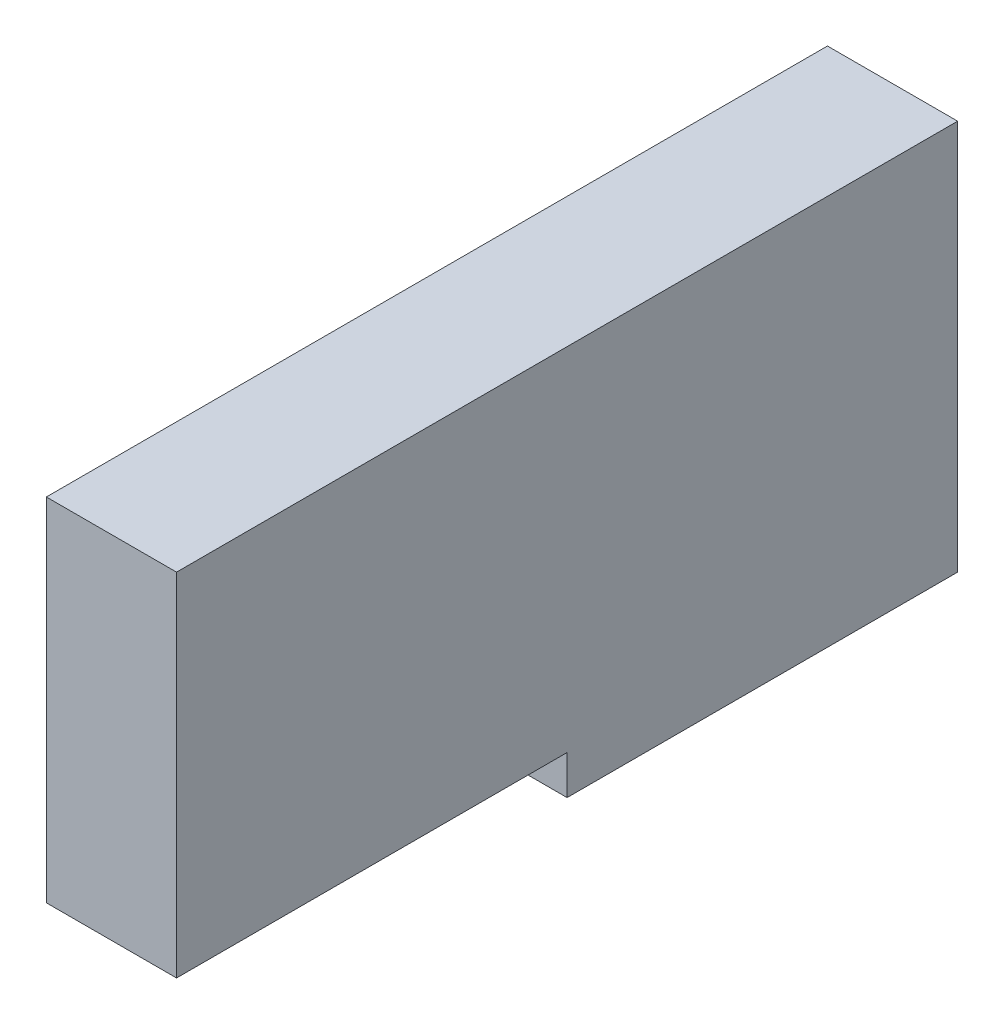
ISO-10303-21;
HEADER;
FILE_DESCRIPTION(('STEP AP214'),'2;1');
FILE_NAME('part.step','',(''),(''),'','','');
FILE_SCHEMA(('AUTOMOTIVE_DESIGN { 1 0 10303 214 1 1 1 1 }'));
ENDSEC;
DATA;
#1=APPLICATION_CONTEXT('core data for automotive mechanical design processes');
#2=APPLICATION_PROTOCOL_DEFINITION('international standard','automotive_design',2000,#1);
#3=PRODUCT_CONTEXT('',#1,'mechanical');
#4=PRODUCT('Part','Part','',(#3));
#5=PRODUCT_RELATED_PRODUCT_CATEGORY('part','',(#4));
#6=PRODUCT_DEFINITION_FORMATION('','',#4);
#7=PRODUCT_DEFINITION_CONTEXT('part definition',#1,'design');
#8=PRODUCT_DEFINITION('design','',#6,#7);
#9=PRODUCT_DEFINITION_SHAPE('','',#8);
#10=(LENGTH_UNIT() NAMED_UNIT(*) SI_UNIT(.MILLI.,.METRE.));
#11=(NAMED_UNIT(*) PLANE_ANGLE_UNIT() SI_UNIT($,.RADIAN.));
#12=(NAMED_UNIT(*) SI_UNIT($,.STERADIAN.) SOLID_ANGLE_UNIT());
#13=UNCERTAINTY_MEASURE_WITH_UNIT(LENGTH_MEASURE(1.E-05),#10,'distance_accuracy_value','');
#14=(GEOMETRIC_REPRESENTATION_CONTEXT(3) GLOBAL_UNCERTAINTY_ASSIGNED_CONTEXT((#13)) GLOBAL_UNIT_ASSIGNED_CONTEXT((#10,
#11,#12)) REPRESENTATION_CONTEXT('',''));
#15=CARTESIAN_POINT('',(0.,0.,0.));
#16=DIRECTION('',(0.,0.,1.));
#17=DIRECTION('',(1.,0.,0.));
#18=AXIS2_PLACEMENT_3D('',#15,#16,#17);
#19=CARTESIAN_POINT('',(0.,0.,30.));
#20=DIRECTION('',(0.,0.,-1.));
#21=DIRECTION('',(-1.,0.,0.));
#22=AXIS2_PLACEMENT_3D('',#19,#20,#21);
#23=PLANE('',#22);
#24=DIRECTION('',(1.,0.,0.));
#25=VECTOR('',#24,1.);
#26=CARTESIAN_POINT('',(0.,3.,30.));
#27=LINE('',#26,#25);
#28=CARTESIAN_POINT('',(0.,3.,30.));
#29=VERTEX_POINT('',#28);
#30=CARTESIAN_POINT('',(10.,3.,30.));
#31=VERTEX_POINT('',#30);
#32=EDGE_CURVE('E48',#29,#31,#27,.T.);
#33=ORIENTED_EDGE('',*,*,#32,.F.);
#34=DIRECTION('',(0.,-1.,0.));
#35=VECTOR('',#34,1.);
#36=CARTESIAN_POINT('',(0.,0.,30.));
#37=LINE('',#36,#35);
#38=CARTESIAN_POINT('',(0.,0.,30.));
#39=VERTEX_POINT('',#38);
#40=EDGE_CURVE('E109',#29,#39,#37,.T.);
#41=ORIENTED_EDGE('',*,*,#40,.T.);
#42=DIRECTION('',(1.,0.,0.));
#43=VECTOR('',#42,1.);
#44=CARTESIAN_POINT('',(0.,0.,30.));
#45=LINE('',#44,#43);
#46=CARTESIAN_POINT('',(10.,0.,30.));
#47=VERTEX_POINT('',#46);
#48=EDGE_CURVE('E111',#39,#47,#45,.T.);
#49=ORIENTED_EDGE('',*,*,#48,.T.);
#50=DIRECTION('',(0.,1.,0.));
#51=VECTOR('',#50,1.);
#52=CARTESIAN_POINT('',(10.,0.,30.));
#53=LINE('',#52,#51);
#54=EDGE_CURVE('E118',#47,#31,#53,.T.);
#55=ORIENTED_EDGE('',*,*,#54,.T.);
#56=EDGE_LOOP('',(#33,#41,#49,#55));
#57=FACE_BOUND('',#56,.T.);
#58=ADVANCED_FACE('F33',(#57),#23,.F.);
#59=CARTESIAN_POINT('',(0.,0.,0.));
#60=DIRECTION('',(0.,0.,-1.));
#61=DIRECTION('',(-1.,0.,0.));
#62=AXIS2_PLACEMENT_3D('',#59,#60,#61);
#63=PLANE('',#62);
#64=CARTESIAN_POINT('',(5.,15.,0.));
#65=DIRECTION('',(0.,0.,1.));
#66=DIRECTION('',(1.,0.,0.));
#67=AXIS2_PLACEMENT_3D('',#64,#65,#66);
#68=CIRCLE('',#67,1.75);
#69=CARTESIAN_POINT('',(6.75,15.,0.));
#70=VERTEX_POINT('',#69);
#71=EDGE_CURVE('E132',#70,#70,#68,.T.);
#72=ORIENTED_EDGE('',*,*,#71,.T.);
#73=EDGE_LOOP('',(#72));
#74=FACE_BOUND('',#73,.T.);
#75=DIRECTION('',(0.,-1.,0.));
#76=VECTOR('',#75,1.);
#77=CARTESIAN_POINT('',(0.,0.,0.));
#78=LINE('',#77,#76);
#79=CARTESIAN_POINT('',(0.,30.,0.));
#80=VERTEX_POINT('',#79);
#81=CARTESIAN_POINT('',(0.,0.,0.));
#82=VERTEX_POINT('',#81);
#83=EDGE_CURVE('E138',#80,#82,#78,.T.);
#84=ORIENTED_EDGE('',*,*,#83,.F.);
#85=DIRECTION('',(-1.,0.,0.));
#86=VECTOR('',#85,1.);
#87=CARTESIAN_POINT('',(0.,30.,0.));
#88=LINE('',#87,#86);
#89=CARTESIAN_POINT('',(10.,30.,0.));
#90=VERTEX_POINT('',#89);
#91=EDGE_CURVE('E56',#90,#80,#88,.T.);
#92=ORIENTED_EDGE('',*,*,#91,.F.);
#93=DIRECTION('',(0.,1.,0.));
#94=VECTOR('',#93,1.);
#95=CARTESIAN_POINT('',(10.,0.,0.));
#96=LINE('',#95,#94);
#97=CARTESIAN_POINT('',(10.,0.,0.));
#98=VERTEX_POINT('',#97);
#99=EDGE_CURVE('E142',#98,#90,#96,.T.);
#100=ORIENTED_EDGE('',*,*,#99,.F.);
#101=DIRECTION('',(1.,0.,0.));
#102=VECTOR('',#101,1.);
#103=CARTESIAN_POINT('',(0.,0.,0.));
#104=LINE('',#103,#102);
#105=EDGE_CURVE('E140',#82,#98,#104,.T.);
#106=ORIENTED_EDGE('',*,*,#105,.F.);
#107=EDGE_LOOP('',(#84,#92,#100,#106));
#108=FACE_BOUND('',#107,.T.);
#109=CARTESIAN_POINT('',(5.,5.,0.));
#110=DIRECTION('',(0.,0.,1.));
#111=DIRECTION('',(1.,0.,0.));
#112=AXIS2_PLACEMENT_3D('',#109,#110,#111);
#113=CIRCLE('',#112,1.75);
#114=CARTESIAN_POINT('',(6.75,5.,0.));
#115=VERTEX_POINT('',#114);
#116=EDGE_CURVE('E135',#115,#115,#113,.T.);
#117=ORIENTED_EDGE('',*,*,#116,.T.);
#118=EDGE_LOOP('',(#117));
#119=FACE_BOUND('',#118,.T.);
#120=CARTESIAN_POINT('',(5.,25.,0.));
#121=DIRECTION('',(0.,0.,1.));
#122=DIRECTION('',(1.,0.,0.));
#123=AXIS2_PLACEMENT_3D('',#120,#121,#122);
#124=CIRCLE('',#123,1.75);
#125=CARTESIAN_POINT('',(6.75,25.,0.));
#126=VERTEX_POINT('',#125);
#127=EDGE_CURVE('E129',#126,#126,#124,.T.);
#128=ORIENTED_EDGE('',*,*,#127,.T.);
#129=EDGE_LOOP('',(#128));
#130=FACE_BOUND('',#129,.T.);
#131=ADVANCED_FACE('F157',(#74,#108,#119,#130),#63,.T.);
#132=CARTESIAN_POINT('',(0.,0.,20.));
#133=DIRECTION('',(1.,0.,0.));
#134=DIRECTION('',(0.,0.,-1.));
#135=AXIS2_PLACEMENT_3D('',#132,#133,#134);
#136=PLANE('',#135);
#137=ORIENTED_EDGE('',*,*,#83,.T.);
#138=DIRECTION('',(0.,0.,-1.));
#139=VECTOR('',#138,1.);
#140=CARTESIAN_POINT('',(0.,0.,20.));
#141=LINE('',#140,#139);
#142=EDGE_CURVE('E11',#39,#82,#141,.T.);
#143=ORIENTED_EDGE('',*,*,#142,.F.);
#144=ORIENTED_EDGE('',*,*,#40,.F.);
#145=DIRECTION('',(0.,0.,-1.));
#146=VECTOR('',#145,1.);
#147=CARTESIAN_POINT('',(0.,3.,60.));
#148=LINE('',#147,#146);
#149=CARTESIAN_POINT('',(0.,3.,60.));
#150=VERTEX_POINT('',#149);
#151=EDGE_CURVE('E91',#150,#29,#148,.T.);
#152=ORIENTED_EDGE('',*,*,#151,.F.);
#153=DIRECTION('',(0.,-1.,0.));
#154=VECTOR('',#153,1.);
#155=CARTESIAN_POINT('',(0.,30.,60.));
#156=LINE('',#155,#154);
#157=CARTESIAN_POINT('',(0.,30.,60.));
#158=VERTEX_POINT('',#157);
#159=EDGE_CURVE('E98',#158,#150,#156,.T.);
#160=ORIENTED_EDGE('',*,*,#159,.F.);
#161=DIRECTION('',(0.,0.,-1.));
#162=VECTOR('',#161,1.);
#163=CARTESIAN_POINT('',(0.,30.,20.));
#164=LINE('',#163,#162);
#165=EDGE_CURVE('E145',#158,#80,#164,.T.);
#166=ORIENTED_EDGE('',*,*,#165,.T.);
#167=EDGE_LOOP('',(#137,#143,#144,#152,#160,#166));
#168=FACE_BOUND('',#167,.T.);
#169=ADVANCED_FACE('F35',(#168),#136,.F.);
#170=CARTESIAN_POINT('',(0.,0.,20.));
#171=DIRECTION('',(0.,1.,0.));
#172=DIRECTION('',(0.,0.,1.));
#173=AXIS2_PLACEMENT_3D('',#170,#171,#172);
#174=PLANE('',#173);
#175=ORIENTED_EDGE('',*,*,#105,.T.);
#176=DIRECTION('',(0.,0.,-1.));
#177=VECTOR('',#176,1.);
#178=CARTESIAN_POINT('',(10.,0.,20.));
#179=LINE('',#178,#177);
#180=EDGE_CURVE('E41',#47,#98,#179,.T.);
#181=ORIENTED_EDGE('',*,*,#180,.F.);
#182=ORIENTED_EDGE('',*,*,#48,.F.);
#183=ORIENTED_EDGE('',*,*,#142,.T.);
#184=EDGE_LOOP('',(#175,#181,#182,#183));
#185=FACE_BOUND('',#184,.T.);
#186=ADVANCED_FACE('F241',(#185),#174,.F.);
#187=CARTESIAN_POINT('',(10.,0.,20.));
#188=DIRECTION('',(-1.,0.,0.));
#189=DIRECTION('',(0.,0.,1.));
#190=AXIS2_PLACEMENT_3D('',#187,#188,#189);
#191=PLANE('',#190);
#192=ORIENTED_EDGE('',*,*,#99,.T.);
#193=DIRECTION('',(0.,0.,-1.));
#194=VECTOR('',#193,1.);
#195=CARTESIAN_POINT('',(10.,30.,20.));
#196=LINE('',#195,#194);
#197=CARTESIAN_POINT('',(10.,30.,60.));
#198=VERTEX_POINT('',#197);
#199=EDGE_CURVE('E147',#198,#90,#196,.T.);
#200=ORIENTED_EDGE('',*,*,#199,.F.);
#201=DIRECTION('',(0.,1.,0.));
#202=VECTOR('',#201,1.);
#203=CARTESIAN_POINT('',(10.,30.,60.));
#204=LINE('',#203,#202);
#205=CARTESIAN_POINT('',(10.,3.,60.));
#206=VERTEX_POINT('',#205);
#207=EDGE_CURVE('E97',#206,#198,#204,.T.);
#208=ORIENTED_EDGE('',*,*,#207,.F.);
#209=DIRECTION('',(0.,0.,-1.));
#210=VECTOR('',#209,1.);
#211=CARTESIAN_POINT('',(10.,3.,60.));
#212=LINE('',#211,#210);
#213=EDGE_CURVE('E93',#206,#31,#212,.T.);
#214=ORIENTED_EDGE('',*,*,#213,.T.);
#215=ORIENTED_EDGE('',*,*,#54,.F.);
#216=ORIENTED_EDGE('',*,*,#180,.T.);
#217=EDGE_LOOP('',(#192,#200,#208,#214,#215,#216));
#218=FACE_BOUND('',#217,.T.);
#219=ADVANCED_FACE('F152',(#218),#191,.F.);
#220=CARTESIAN_POINT('',(0.,30.,20.));
#221=DIRECTION('',(0.,-1.,0.));
#222=DIRECTION('',(0.,0.,-1.));
#223=AXIS2_PLACEMENT_3D('',#220,#221,#222);
#224=PLANE('',#223);
#225=ORIENTED_EDGE('',*,*,#91,.T.);
#226=ORIENTED_EDGE('',*,*,#165,.F.);
#227=DIRECTION('',(-1.,0.,0.));
#228=VECTOR('',#227,1.);
#229=CARTESIAN_POINT('',(0.,30.,60.));
#230=LINE('',#229,#228);
#231=EDGE_CURVE('E104',#198,#158,#230,.T.);
#232=ORIENTED_EDGE('',*,*,#231,.F.);
#233=ORIENTED_EDGE('',*,*,#199,.T.);
#234=EDGE_LOOP('',(#225,#226,#232,#233));
#235=FACE_BOUND('',#234,.T.);
#236=ADVANCED_FACE('F159',(#235),#224,.F.);
#237=CARTESIAN_POINT('',(5.,5.,20.));
#238=DIRECTION('',(0.,0.,-1.));
#239=DIRECTION('',(-1.,0.,0.));
#240=AXIS2_PLACEMENT_3D('',#237,#238,#239);
#241=CYLINDRICAL_SURFACE('',#240,1.75);
#242=CARTESIAN_POINT('',(5.,5.,20.));
#243=DIRECTION('',(0.,0.,-1.));
#244=DIRECTION('',(-1.,0.,0.));
#245=AXIS2_PLACEMENT_3D('',#242,#243,#244);
#246=CIRCLE('',#245,1.75);
#247=CARTESIAN_POINT('',(3.25,5.,20.));
#248=VERTEX_POINT('',#247);
#249=EDGE_CURVE('E126',#248,#248,#246,.T.);
#250=ORIENTED_EDGE('',*,*,#249,.F.);
#251=EDGE_LOOP('',(#250));
#252=FACE_BOUND('',#251,.T.);
#253=ORIENTED_EDGE('',*,*,#116,.F.);
#254=EDGE_LOOP('',(#253));
#255=FACE_BOUND('',#254,.T.);
#256=ADVANCED_FACE('F233',(#252,#255),#241,.F.);
#257=CARTESIAN_POINT('',(5.,15.,20.));
#258=DIRECTION('',(0.,0.,-1.));
#259=DIRECTION('',(-1.,0.,0.));
#260=AXIS2_PLACEMENT_3D('',#257,#258,#259);
#261=CYLINDRICAL_SURFACE('',#260,1.75);
#262=CARTESIAN_POINT('',(5.,15.,20.));
#263=DIRECTION('',(0.,0.,-1.));
#264=DIRECTION('',(-1.,0.,0.));
#265=AXIS2_PLACEMENT_3D('',#262,#263,#264);
#266=CIRCLE('',#265,1.75);
#267=CARTESIAN_POINT('',(3.25,15.,20.));
#268=VERTEX_POINT('',#267);
#269=EDGE_CURVE('E123',#268,#268,#266,.T.);
#270=ORIENTED_EDGE('',*,*,#269,.F.);
#271=EDGE_LOOP('',(#270));
#272=FACE_BOUND('',#271,.T.);
#273=ORIENTED_EDGE('',*,*,#71,.F.);
#274=EDGE_LOOP('',(#273));
#275=FACE_BOUND('',#274,.T.);
#276=ADVANCED_FACE('F229',(#272,#275),#261,.F.);
#277=CARTESIAN_POINT('',(5.,25.,20.));
#278=DIRECTION('',(0.,0.,-1.));
#279=DIRECTION('',(-1.,0.,0.));
#280=AXIS2_PLACEMENT_3D('',#277,#278,#279);
#281=CYLINDRICAL_SURFACE('',#280,1.75);
#282=CARTESIAN_POINT('',(5.,25.,20.));
#283=DIRECTION('',(0.,0.,-1.));
#284=DIRECTION('',(-1.,0.,0.));
#285=AXIS2_PLACEMENT_3D('',#282,#283,#284);
#286=CIRCLE('',#285,1.75);
#287=CARTESIAN_POINT('',(3.25,25.,20.));
#288=VERTEX_POINT('',#287);
#289=EDGE_CURVE('E120',#288,#288,#286,.T.);
#290=ORIENTED_EDGE('',*,*,#289,.F.);
#291=EDGE_LOOP('',(#290));
#292=FACE_BOUND('',#291,.T.);
#293=ORIENTED_EDGE('',*,*,#127,.F.);
#294=EDGE_LOOP('',(#293));
#295=FACE_BOUND('',#294,.T.);
#296=ADVANCED_FACE('F226',(#292,#295),#281,.F.);
#297=CARTESIAN_POINT('',(0.,0.,20.));
#298=DIRECTION('',(0.,0.,-1.));
#299=DIRECTION('',(-1.,0.,0.));
#300=AXIS2_PLACEMENT_3D('',#297,#298,#299);
#301=PLANE('',#300);
#302=ORIENTED_EDGE('',*,*,#289,.T.);
#303=EDGE_LOOP('',(#302));
#304=FACE_BOUND('',#303,.T.);
#305=ADVANCED_FACE('F225',(#304),#301,.T.);
#306=ORIENTED_EDGE('',*,*,#269,.T.);
#307=EDGE_LOOP('',(#306));
#308=FACE_BOUND('',#307,.T.);
#309=ADVANCED_FACE('F223',(#308),#301,.T.);
#310=ORIENTED_EDGE('',*,*,#249,.T.);
#311=EDGE_LOOP('',(#310));
#312=FACE_BOUND('',#311,.T.);
#313=ADVANCED_FACE('F195',(#312),#301,.T.);
#314=CARTESIAN_POINT('',(0.,3.,60.));
#315=DIRECTION('',(0.,1.,0.));
#316=DIRECTION('',(-1.,0.,0.));
#317=AXIS2_PLACEMENT_3D('',#314,#315,#316);
#318=PLANE('',#317);
#319=CARTESIAN_POINT('',(5.,3.,45.));
#320=DIRECTION('',(0.,-1.,0.));
#321=DIRECTION('',(1.,0.,0.));
#322=AXIS2_PLACEMENT_3D('',#319,#320,#321);
#323=CIRCLE('',#322,1.75);
#324=CARTESIAN_POINT('',(6.75,3.,45.));
#325=VERTEX_POINT('',#324);
#326=EDGE_CURVE('E178',#325,#325,#323,.T.);
#327=ORIENTED_EDGE('',*,*,#326,.F.);
#328=EDGE_LOOP('',(#327));
#329=FACE_BOUND('',#328,.T.);
#330=CARTESIAN_POINT('',(5.,3.,35.));
#331=DIRECTION('',(0.,-1.,0.));
#332=DIRECTION('',(1.,0.,0.));
#333=AXIS2_PLACEMENT_3D('',#330,#331,#332);
#334=CIRCLE('',#333,1.75);
#335=CARTESIAN_POINT('',(6.75,3.,35.));
#336=VERTEX_POINT('',#335);
#337=EDGE_CURVE('E172',#336,#336,#334,.T.);
#338=ORIENTED_EDGE('',*,*,#337,.F.);
#339=EDGE_LOOP('',(#338));
#340=FACE_BOUND('',#339,.T.);
#341=CARTESIAN_POINT('',(5.,3.,55.));
#342=DIRECTION('',(0.,-1.,0.));
#343=DIRECTION('',(1.,0.,0.));
#344=AXIS2_PLACEMENT_3D('',#341,#342,#343);
#345=CIRCLE('',#344,1.75);
#346=CARTESIAN_POINT('',(6.75,3.,55.));
#347=VERTEX_POINT('',#346);
#348=EDGE_CURVE('E164',#347,#347,#345,.T.);
#349=ORIENTED_EDGE('',*,*,#348,.F.);
#350=EDGE_LOOP('',(#349));
#351=FACE_BOUND('',#350,.T.);
#352=ORIENTED_EDGE('',*,*,#32,.T.);
#353=ORIENTED_EDGE('',*,*,#213,.F.);
#354=DIRECTION('',(1.,0.,0.));
#355=VECTOR('',#354,1.);
#356=CARTESIAN_POINT('',(0.,3.,60.));
#357=LINE('',#356,#355);
#358=EDGE_CURVE('E87',#150,#206,#357,.T.);
#359=ORIENTED_EDGE('',*,*,#358,.F.);
#360=ORIENTED_EDGE('',*,*,#151,.T.);
#361=EDGE_LOOP('',(#352,#353,#359,#360));
#362=FACE_BOUND('',#361,.T.);
#363=ADVANCED_FACE('F89',(#329,#340,#351,#362),#318,.F.);
#364=CARTESIAN_POINT('',(0.,0.,60.));
#365=DIRECTION('',(0.,0.,1.));
#366=DIRECTION('',(1.,0.,0.));
#367=AXIS2_PLACEMENT_3D('',#364,#365,#366);
#368=PLANE('',#367);
#369=ORIENTED_EDGE('',*,*,#159,.T.);
#370=ORIENTED_EDGE('',*,*,#358,.T.);
#371=ORIENTED_EDGE('',*,*,#207,.T.);
#372=ORIENTED_EDGE('',*,*,#231,.T.);
#373=EDGE_LOOP('',(#369,#370,#371,#372));
#374=FACE_BOUND('',#373,.T.);
#375=ADVANCED_FACE('F102',(#374),#368,.T.);
#376=CARTESIAN_POINT('',(5.,18.,55.));
#377=DIRECTION('',(0.,-1.,0.));
#378=DIRECTION('',(1.,0.,0.));
#379=AXIS2_PLACEMENT_3D('',#376,#377,#378);
#380=CYLINDRICAL_SURFACE('',#379,1.75);
#381=CARTESIAN_POINT('',(5.,18.,55.));
#382=DIRECTION('',(0.,-1.,0.));
#383=DIRECTION('',(1.,0.,0.));
#384=AXIS2_PLACEMENT_3D('',#381,#382,#383);
#385=CIRCLE('',#384,1.75);
#386=CARTESIAN_POINT('',(6.75,18.,55.));
#387=VERTEX_POINT('',#386);
#388=EDGE_CURVE('E162',#387,#387,#385,.T.);
#389=ORIENTED_EDGE('',*,*,#388,.F.);
#390=EDGE_LOOP('',(#389));
#391=FACE_BOUND('',#390,.T.);
#392=ORIENTED_EDGE('',*,*,#348,.T.);
#393=EDGE_LOOP('',(#392));
#394=FACE_BOUND('',#393,.T.);
#395=ADVANCED_FACE('F201',(#391,#394),#380,.F.);
#396=CARTESIAN_POINT('',(5.,18.,55.));
#397=DIRECTION('',(0.,-1.,0.));
#398=DIRECTION('',(1.,0.,0.));
#399=AXIS2_PLACEMENT_3D('',#396,#397,#398);
#400=PLANE('',#399);
#401=ORIENTED_EDGE('',*,*,#388,.T.);
#402=EDGE_LOOP('',(#401));
#403=FACE_BOUND('',#402,.T.);
#404=ADVANCED_FACE('F203',(#403),#400,.T.);
#405=CARTESIAN_POINT('',(5.,18.,35.));
#406=DIRECTION('',(0.,-1.,0.));
#407=DIRECTION('',(1.,0.,0.));
#408=AXIS2_PLACEMENT_3D('',#405,#406,#407);
#409=CYLINDRICAL_SURFACE('',#408,1.75);
#410=CARTESIAN_POINT('',(5.,18.,35.));
#411=DIRECTION('',(0.,-1.,0.));
#412=DIRECTION('',(1.,0.,0.));
#413=AXIS2_PLACEMENT_3D('',#410,#411,#412);
#414=CIRCLE('',#413,1.75);
#415=CARTESIAN_POINT('',(6.75,18.,35.));
#416=VERTEX_POINT('',#415);
#417=EDGE_CURVE('E175',#416,#416,#414,.T.);
#418=ORIENTED_EDGE('',*,*,#417,.F.);
#419=EDGE_LOOP('',(#418));
#420=FACE_BOUND('',#419,.T.);
#421=ORIENTED_EDGE('',*,*,#337,.T.);
#422=EDGE_LOOP('',(#421));
#423=FACE_BOUND('',#422,.T.);
#424=ADVANCED_FACE('F210',(#420,#423),#409,.F.);
#425=CARTESIAN_POINT('',(5.,18.,35.));
#426=DIRECTION('',(0.,-1.,0.));
#427=DIRECTION('',(1.,0.,0.));
#428=AXIS2_PLACEMENT_3D('',#425,#426,#427);
#429=PLANE('',#428);
#430=ORIENTED_EDGE('',*,*,#417,.T.);
#431=EDGE_LOOP('',(#430));
#432=FACE_BOUND('',#431,.T.);
#433=ADVANCED_FACE('F189',(#432),#429,.T.);
#434=CARTESIAN_POINT('',(5.,18.,45.));
#435=DIRECTION('',(0.,-1.,0.));
#436=DIRECTION('',(1.,0.,0.));
#437=AXIS2_PLACEMENT_3D('',#434,#435,#436);
#438=CYLINDRICAL_SURFACE('',#437,1.75);
#439=CARTESIAN_POINT('',(5.,18.,45.));
#440=DIRECTION('',(0.,-1.,0.));
#441=DIRECTION('',(1.,0.,0.));
#442=AXIS2_PLACEMENT_3D('',#439,#440,#441);
#443=CIRCLE('',#442,1.75);
#444=CARTESIAN_POINT('',(6.75,18.,45.));
#445=VERTEX_POINT('',#444);
#446=EDGE_CURVE('E169',#445,#445,#443,.T.);
#447=ORIENTED_EDGE('',*,*,#446,.F.);
#448=EDGE_LOOP('',(#447));
#449=FACE_BOUND('',#448,.T.);
#450=ORIENTED_EDGE('',*,*,#326,.T.);
#451=EDGE_LOOP('',(#450));
#452=FACE_BOUND('',#451,.T.);
#453=ADVANCED_FACE('F186',(#449,#452),#438,.F.);
#454=CARTESIAN_POINT('',(5.,18.,45.));
#455=DIRECTION('',(0.,-1.,0.));
#456=DIRECTION('',(1.,0.,0.));
#457=AXIS2_PLACEMENT_3D('',#454,#455,#456);
#458=PLANE('',#457);
#459=ORIENTED_EDGE('',*,*,#446,.T.);
#460=EDGE_LOOP('',(#459));
#461=FACE_BOUND('',#460,.T.);
#462=ADVANCED_FACE('F184',(#461),#458,.T.);
#463=CLOSED_SHELL('',(#58,#131,#169,#186,#219,#236,#256,#276,#296,#305,#309,#313,#363,#375,#395,
#404,#424,#433,#453,#462));
#464=MANIFOLD_SOLID_BREP('B2',#463);
#465=ADVANCED_BREP_SHAPE_REPRESENTATION('',(#18,#464),#14);
#466=SHAPE_DEFINITION_REPRESENTATION(#9,#465);
ENDSEC;
END-ISO-10303-21;
